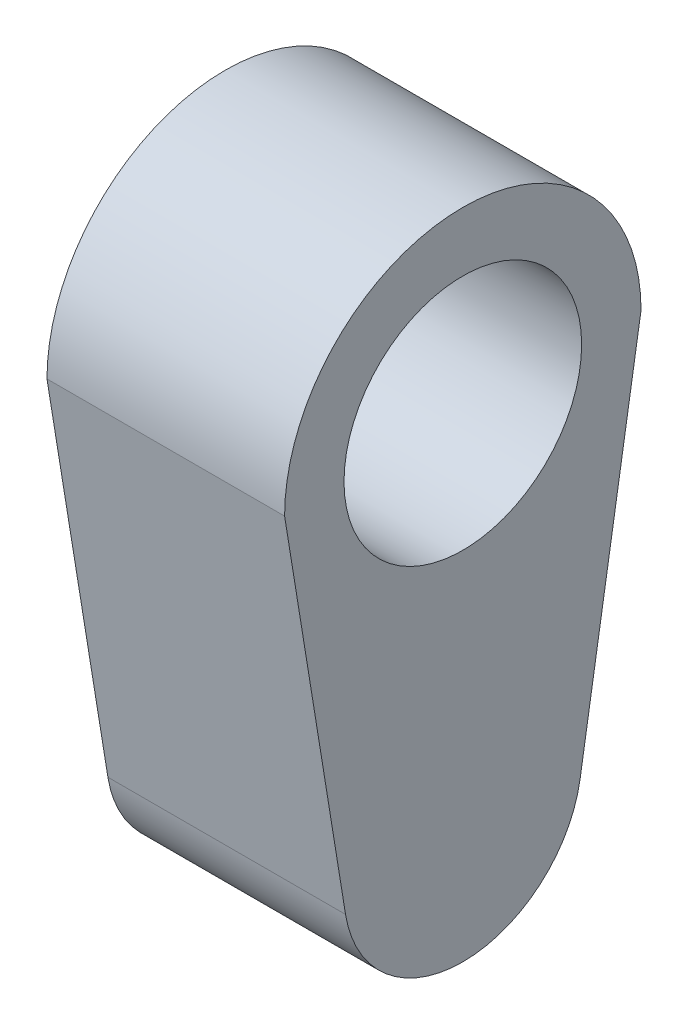
ISO-10303-21;
HEADER;
FILE_DESCRIPTION(('STEP AP214'),'2;1');
FILE_NAME('part.step','',(''),(''),'','','');
FILE_SCHEMA(('AUTOMOTIVE_DESIGN { 1 0 10303 214 1 1 1 1 }'));
ENDSEC;
DATA;
#1=APPLICATION_CONTEXT('core data for automotive mechanical design processes');
#2=APPLICATION_PROTOCOL_DEFINITION('international standard','automotive_design',2000,#1);
#3=PRODUCT_CONTEXT('',#1,'mechanical');
#4=PRODUCT('Part','Part','',(#3));
#5=PRODUCT_RELATED_PRODUCT_CATEGORY('part','',(#4));
#6=PRODUCT_DEFINITION_FORMATION('','',#4);
#7=PRODUCT_DEFINITION_CONTEXT('part definition',#1,'design');
#8=PRODUCT_DEFINITION('design','',#6,#7);
#9=PRODUCT_DEFINITION_SHAPE('','',#8);
#10=(LENGTH_UNIT() NAMED_UNIT(*) SI_UNIT(.MILLI.,.METRE.));
#11=(NAMED_UNIT(*) PLANE_ANGLE_UNIT() SI_UNIT($,.RADIAN.));
#12=(NAMED_UNIT(*) SI_UNIT($,.STERADIAN.) SOLID_ANGLE_UNIT());
#13=UNCERTAINTY_MEASURE_WITH_UNIT(LENGTH_MEASURE(1.E-05),#10,'distance_accuracy_value','');
#14=(GEOMETRIC_REPRESENTATION_CONTEXT(3) GLOBAL_UNCERTAINTY_ASSIGNED_CONTEXT((#13)) GLOBAL_UNIT_ASSIGNED_CONTEXT((#10,
#11,#12)) REPRESENTATION_CONTEXT('',''));
#15=CARTESIAN_POINT('',(0.,0.,0.));
#16=DIRECTION('',(0.,0.,1.));
#17=DIRECTION('',(1.,0.,0.));
#18=AXIS2_PLACEMENT_3D('',#15,#16,#17);
#19=CARTESIAN_POINT('',(5.08,0.,0.));
#20=DIRECTION('',(1.,0.,0.));
#21=DIRECTION('',(0.,0.,-1.));
#22=AXIS2_PLACEMENT_3D('',#19,#20,#21);
#23=PLANE('',#22);
#24=CARTESIAN_POINT('',(5.08,0.,0.));
#25=DIRECTION('',(1.,0.,0.));
#26=DIRECTION('',(0.,0.,-1.));
#27=AXIS2_PLACEMENT_3D('',#24,#25,#26);
#28=CIRCLE('',#27,3.81);
#29=CARTESIAN_POINT('',(5.08,0.,-3.81));
#30=VERTEX_POINT('',#29);
#31=CARTESIAN_POINT('',(5.08,0.,3.81));
#32=VERTEX_POINT('',#31);
#33=EDGE_CURVE('E90',#30,#32,#28,.T.);
#34=ORIENTED_EDGE('',*,*,#33,.T.);
#35=DIRECTION('',(0.,-0.987083231657713,-0.160208282495523));
#36=VECTOR('',#35,1.);
#37=CARTESIAN_POINT('',(5.08,0.,3.81));
#38=LINE('',#37,#36);
#39=CARTESIAN_POINT('',(5.08,-8.02692903753863,2.50719140841059));
#40=VERTEX_POINT('',#39);
#41=EDGE_CURVE('E85',#32,#40,#38,.T.);
#42=ORIENTED_EDGE('',*,*,#41,.T.);
#43=CARTESIAN_POINT('',(5.08,-7.62,0.));
#44=DIRECTION('',(1.,0.,0.));
#45=DIRECTION('',(0.,0.,-1.));
#46=AXIS2_PLACEMENT_3D('',#43,#44,#45);
#47=CIRCLE('',#46,2.54);
#48=CARTESIAN_POINT('',(5.08,-8.02692903753863,-2.50719140841059));
#49=VERTEX_POINT('',#48);
#50=EDGE_CURVE('E88',#40,#49,#47,.T.);
#51=ORIENTED_EDGE('',*,*,#50,.T.);
#52=DIRECTION('',(0.,0.987083231657713,-0.160208282495523));
#53=VECTOR('',#52,1.);
#54=CARTESIAN_POINT('',(5.08,0.,-3.81));
#55=LINE('',#54,#53);
#56=EDGE_CURVE('E54',#49,#30,#55,.T.);
#57=ORIENTED_EDGE('',*,*,#56,.T.);
#58=EDGE_LOOP('',(#34,#42,#51,#57));
#59=FACE_BOUND('',#58,.T.);
#60=CARTESIAN_POINT('',(5.08,0.,0.));
#61=DIRECTION('',(1.,0.,0.));
#62=DIRECTION('',(0.,0.,-1.));
#63=AXIS2_PLACEMENT_3D('',#60,#61,#62);
#64=CIRCLE('',#63,2.54);
#65=CARTESIAN_POINT('',(5.08,0.,-2.54));
#66=VERTEX_POINT('',#65);
#67=EDGE_CURVE('E107',#66,#66,#64,.T.);
#68=ORIENTED_EDGE('',*,*,#67,.F.);
#69=EDGE_LOOP('',(#68));
#70=FACE_BOUND('',#69,.T.);
#71=ADVANCED_FACE('F37',(#59,#70),#23,.T.);
#72=CARTESIAN_POINT('',(0.,0.,0.));
#73=DIRECTION('',(1.,0.,0.));
#74=DIRECTION('',(0.,0.,-1.));
#75=AXIS2_PLACEMENT_3D('',#72,#73,#74);
#76=PLANE('',#75);
#77=CARTESIAN_POINT('',(0.,0.,0.));
#78=DIRECTION('',(1.,0.,0.));
#79=DIRECTION('',(0.,0.,-1.));
#80=AXIS2_PLACEMENT_3D('',#77,#78,#79);
#81=CIRCLE('',#80,3.81);
#82=CARTESIAN_POINT('',(0.,0.,-3.81));
#83=VERTEX_POINT('',#82);
#84=CARTESIAN_POINT('',(0.,0.,3.81));
#85=VERTEX_POINT('',#84);
#86=EDGE_CURVE('E104',#83,#85,#81,.T.);
#87=ORIENTED_EDGE('',*,*,#86,.F.);
#88=DIRECTION('',(0.,0.987083231657713,-0.160208282495523));
#89=VECTOR('',#88,1.);
#90=CARTESIAN_POINT('',(0.,0.,-3.81));
#91=LINE('',#90,#89);
#92=CARTESIAN_POINT('',(0.,-8.02692903753863,-2.50719140841059));
#93=VERTEX_POINT('',#92);
#94=EDGE_CURVE('E77',#93,#83,#91,.T.);
#95=ORIENTED_EDGE('',*,*,#94,.F.);
#96=CARTESIAN_POINT('',(0.,-7.62,0.));
#97=DIRECTION('',(1.,0.,0.));
#98=DIRECTION('',(0.,0.,-1.));
#99=AXIS2_PLACEMENT_3D('',#96,#97,#98);
#100=CIRCLE('',#99,2.54);
#101=CARTESIAN_POINT('',(0.,-8.02692903753863,2.50719140841059));
#102=VERTEX_POINT('',#101);
#103=EDGE_CURVE('E71',#102,#93,#100,.T.);
#104=ORIENTED_EDGE('',*,*,#103,.F.);
#105=DIRECTION('',(0.,-0.987083231657713,-0.160208282495523));
#106=VECTOR('',#105,1.);
#107=CARTESIAN_POINT('',(0.,0.,3.81));
#108=LINE('',#107,#106);
#109=EDGE_CURVE('E95',#85,#102,#108,.T.);
#110=ORIENTED_EDGE('',*,*,#109,.F.);
#111=EDGE_LOOP('',(#87,#95,#104,#110));
#112=FACE_BOUND('',#111,.T.);
#113=ADVANCED_FACE('F115',(#112),#76,.F.);
#114=CARTESIAN_POINT('',(5.08,0.,0.));
#115=DIRECTION('',(-1.,0.,0.));
#116=DIRECTION('',(0.,0.,1.));
#117=AXIS2_PLACEMENT_3D('',#114,#115,#116);
#118=CYLINDRICAL_SURFACE('',#117,3.81);
#119=ORIENTED_EDGE('',*,*,#86,.T.);
#120=DIRECTION('',(-1.,0.,0.));
#121=VECTOR('',#120,1.);
#122=CARTESIAN_POINT('',(5.08,0.,3.81));
#123=LINE('',#122,#121);
#124=EDGE_CURVE('E46',#32,#85,#123,.T.);
#125=ORIENTED_EDGE('',*,*,#124,.F.);
#126=ORIENTED_EDGE('',*,*,#33,.F.);
#127=DIRECTION('',(-1.,0.,0.));
#128=VECTOR('',#127,1.);
#129=CARTESIAN_POINT('',(5.08,0.,-3.81));
#130=LINE('',#129,#128);
#131=EDGE_CURVE('E100',#30,#83,#130,.T.);
#132=ORIENTED_EDGE('',*,*,#131,.T.);
#133=EDGE_LOOP('',(#119,#125,#126,#132));
#134=FACE_BOUND('',#133,.T.);
#135=ADVANCED_FACE('F39',(#134),#118,.T.);
#136=CARTESIAN_POINT('',(5.08,0.,3.81));
#137=DIRECTION('',(0.,0.160208282495523,-0.987083231657713));
#138=DIRECTION('',(0.,0.987083231657713,0.160208282495523));
#139=AXIS2_PLACEMENT_3D('',#136,#137,#138);
#140=PLANE('',#139);
#141=ORIENTED_EDGE('',*,*,#109,.T.);
#142=DIRECTION('',(-1.,0.,0.));
#143=VECTOR('',#142,1.);
#144=CARTESIAN_POINT('',(5.08,-8.02692903753863,2.50719140841059));
#145=LINE('',#144,#143);
#146=EDGE_CURVE('E93',#40,#102,#145,.T.);
#147=ORIENTED_EDGE('',*,*,#146,.F.);
#148=ORIENTED_EDGE('',*,*,#41,.F.);
#149=ORIENTED_EDGE('',*,*,#124,.T.);
#150=EDGE_LOOP('',(#141,#147,#148,#149));
#151=FACE_BOUND('',#150,.T.);
#152=ADVANCED_FACE('F94',(#151),#140,.F.);
#153=CARTESIAN_POINT('',(5.08,-7.62,0.));
#154=DIRECTION('',(-1.,0.,0.));
#155=DIRECTION('',(0.,0.,1.));
#156=AXIS2_PLACEMENT_3D('',#153,#154,#155);
#157=CYLINDRICAL_SURFACE('',#156,2.54);
#158=ORIENTED_EDGE('',*,*,#103,.T.);
#159=DIRECTION('',(-1.,0.,0.));
#160=VECTOR('',#159,1.);
#161=CARTESIAN_POINT('',(5.08,-8.02692903753863,-2.50719140841059));
#162=LINE('',#161,#160);
#163=EDGE_CURVE('E96',#49,#93,#162,.T.);
#164=ORIENTED_EDGE('',*,*,#163,.F.);
#165=ORIENTED_EDGE('',*,*,#50,.F.);
#166=ORIENTED_EDGE('',*,*,#146,.T.);
#167=EDGE_LOOP('',(#158,#164,#165,#166));
#168=FACE_BOUND('',#167,.T.);
#169=ADVANCED_FACE('F98',(#168),#157,.T.);
#170=CARTESIAN_POINT('',(5.08,0.,-3.81));
#171=DIRECTION('',(0.,0.160208282495523,0.987083231657713));
#172=DIRECTION('',(0.,-0.987083231657713,0.160208282495523));
#173=AXIS2_PLACEMENT_3D('',#170,#171,#172);
#174=PLANE('',#173);
#175=ORIENTED_EDGE('',*,*,#94,.T.);
#176=ORIENTED_EDGE('',*,*,#131,.F.);
#177=ORIENTED_EDGE('',*,*,#56,.F.);
#178=ORIENTED_EDGE('',*,*,#163,.T.);
#179=EDGE_LOOP('',(#175,#176,#177,#178));
#180=FACE_BOUND('',#179,.T.);
#181=ADVANCED_FACE('F125',(#180),#174,.F.);
#182=CARTESIAN_POINT('',(5.08,0.,0.));
#183=DIRECTION('',(-1.,0.,0.));
#184=DIRECTION('',(0.,0.,1.));
#185=AXIS2_PLACEMENT_3D('',#182,#183,#184);
#186=CYLINDRICAL_SURFACE('',#185,2.54);
#187=CARTESIAN_POINT('',(1.016,0.,0.));
#188=DIRECTION('',(1.,0.,0.));
#189=DIRECTION('',(0.,0.,-1.));
#190=AXIS2_PLACEMENT_3D('',#187,#188,#189);
#191=CIRCLE('',#190,2.54);
#192=CARTESIAN_POINT('',(1.016,0.,-2.54));
#193=VERTEX_POINT('',#192);
#194=EDGE_CURVE('E11',#193,#193,#191,.T.);
#195=ORIENTED_EDGE('',*,*,#194,.F.);
#196=EDGE_LOOP('',(#195));
#197=FACE_BOUND('',#196,.T.);
#198=ORIENTED_EDGE('',*,*,#67,.T.);
#199=EDGE_LOOP('',(#198));
#200=FACE_BOUND('',#199,.T.);
#201=ADVANCED_FACE('F128',(#197,#200),#186,.F.);
#202=CARTESIAN_POINT('',(1.016,0.,0.));
#203=DIRECTION('',(1.,0.,0.));
#204=DIRECTION('',(0.,0.,-1.));
#205=AXIS2_PLACEMENT_3D('',#202,#203,#204);
#206=PLANE('',#205);
#207=ORIENTED_EDGE('',*,*,#194,.T.);
#208=EDGE_LOOP('',(#207));
#209=FACE_BOUND('',#208,.T.);
#210=ADVANCED_FACE('F149',(#209),#206,.T.);
#211=CLOSED_SHELL('',(#71,#113,#135,#152,#169,#181,#201,#210));
#212=MANIFOLD_SOLID_BREP('B2',#211);
#213=ADVANCED_BREP_SHAPE_REPRESENTATION('',(#18,#212),#14);
#214=SHAPE_DEFINITION_REPRESENTATION(#9,#213);
ENDSEC;
END-ISO-10303-21;
